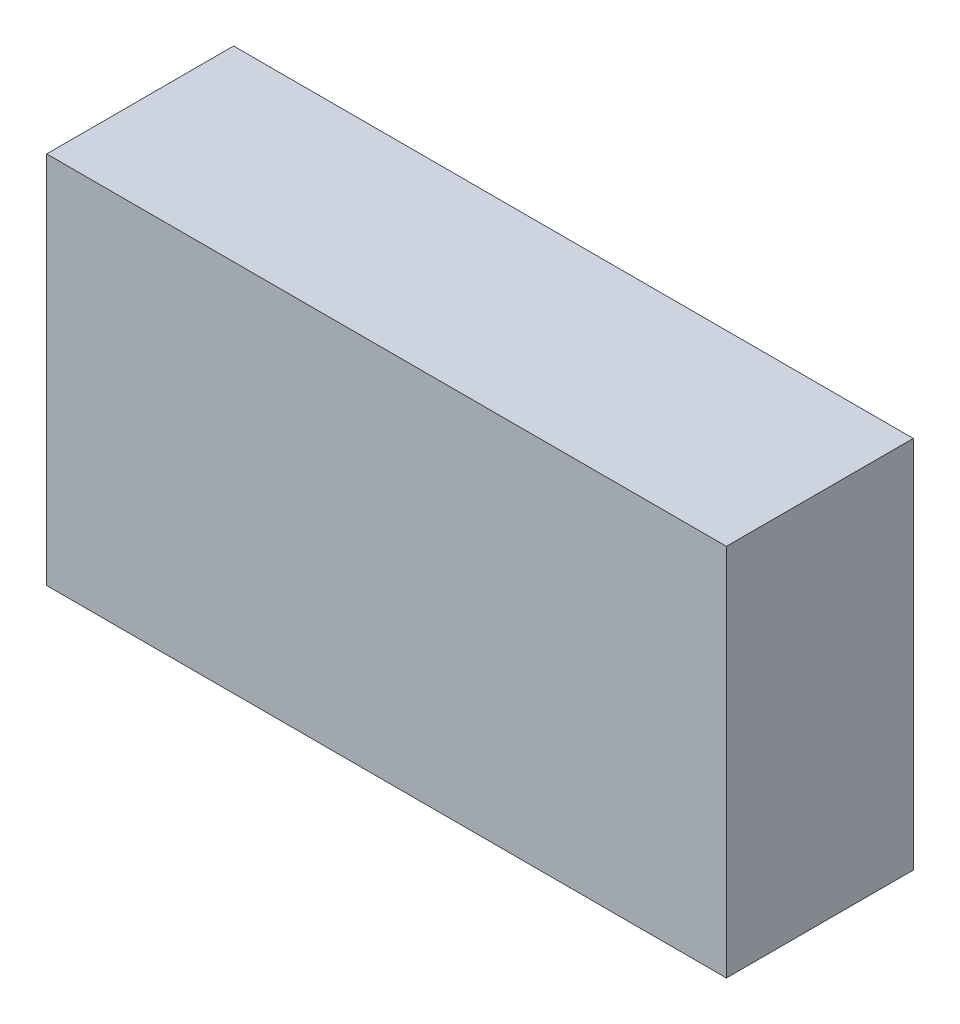
ISO-10303-21;
HEADER;
FILE_DESCRIPTION(('STEP AP214'),'2;1');
FILE_NAME('part.step','',(''),(''),'','','');
FILE_SCHEMA(('AUTOMOTIVE_DESIGN { 1 0 10303 214 1 1 1 1 }'));
ENDSEC;
DATA;
#1=APPLICATION_CONTEXT('core data for automotive mechanical design processes');
#2=APPLICATION_PROTOCOL_DEFINITION('international standard','automotive_design',2000,#1);
#3=PRODUCT_CONTEXT('',#1,'mechanical');
#4=PRODUCT('Part','Part','',(#3));
#5=PRODUCT_RELATED_PRODUCT_CATEGORY('part','',(#4));
#6=PRODUCT_DEFINITION_FORMATION('','',#4);
#7=PRODUCT_DEFINITION_CONTEXT('part definition',#1,'design');
#8=PRODUCT_DEFINITION('design','',#6,#7);
#9=PRODUCT_DEFINITION_SHAPE('','',#8);
#10=(LENGTH_UNIT() NAMED_UNIT(*) SI_UNIT(.MILLI.,.METRE.));
#11=(NAMED_UNIT(*) PLANE_ANGLE_UNIT() SI_UNIT($,.RADIAN.));
#12=(NAMED_UNIT(*) SI_UNIT($,.STERADIAN.) SOLID_ANGLE_UNIT());
#13=UNCERTAINTY_MEASURE_WITH_UNIT(LENGTH_MEASURE(1.E-05),#10,'distance_accuracy_value','');
#14=(GEOMETRIC_REPRESENTATION_CONTEXT(3) GLOBAL_UNCERTAINTY_ASSIGNED_CONTEXT((#13)) GLOBAL_UNIT_ASSIGNED_CONTEXT((#10,
#11,#12)) REPRESENTATION_CONTEXT('',''));
#15=CARTESIAN_POINT('',(0.,0.,0.));
#16=DIRECTION('',(0.,0.,1.));
#17=DIRECTION('',(1.,0.,0.));
#18=AXIS2_PLACEMENT_3D('',#15,#16,#17);
#19=CARTESIAN_POINT('',(3.,27.,11.));
#20=DIRECTION('',(1.,0.,0.));
#21=DIRECTION('',(0.,0.,-1.));
#22=AXIS2_PLACEMENT_3D('',#19,#20,#21);
#23=PLANE('',#22);
#24=DIRECTION('',(0.,-1.,0.));
#25=VECTOR('',#24,1.);
#26=CARTESIAN_POINT('',(3.,27.,0.));
#27=LINE('',#26,#25);
#28=CARTESIAN_POINT('',(3.,27.,0.));
#29=VERTEX_POINT('',#28);
#30=CARTESIAN_POINT('',(3.,5.,0.));
#31=VERTEX_POINT('',#30);
#32=EDGE_CURVE('E104',#29,#31,#27,.T.);
#33=ORIENTED_EDGE('',*,*,#32,.T.);
#34=DIRECTION('',(0.,0.,-1.));
#35=VECTOR('',#34,1.);
#36=CARTESIAN_POINT('',(3.,5.,11.));
#37=LINE('',#36,#35);
#38=CARTESIAN_POINT('',(3.,5.,11.));
#39=VERTEX_POINT('',#38);
#40=EDGE_CURVE('E11',#39,#31,#37,.T.);
#41=ORIENTED_EDGE('',*,*,#40,.F.);
#42=DIRECTION('',(0.,-1.,0.));
#43=VECTOR('',#42,1.);
#44=CARTESIAN_POINT('',(3.,27.,11.));
#45=LINE('',#44,#43);
#46=CARTESIAN_POINT('',(3.,27.,11.));
#47=VERTEX_POINT('',#46);
#48=EDGE_CURVE('E92',#47,#39,#45,.T.);
#49=ORIENTED_EDGE('',*,*,#48,.F.);
#50=DIRECTION('',(0.,0.,-1.));
#51=VECTOR('',#50,1.);
#52=CARTESIAN_POINT('',(3.,27.,11.));
#53=LINE('',#52,#51);
#54=EDGE_CURVE('E100',#47,#29,#53,.T.);
#55=ORIENTED_EDGE('',*,*,#54,.T.);
#56=EDGE_LOOP('',(#33,#41,#49,#55));
#57=FACE_BOUND('',#56,.T.);
#58=ADVANCED_FACE('F41',(#57),#23,.F.);
#59=CARTESIAN_POINT('',(3.,5.,11.));
#60=DIRECTION('',(0.,1.,0.));
#61=DIRECTION('',(0.,0.,1.));
#62=AXIS2_PLACEMENT_3D('',#59,#60,#61);
#63=PLANE('',#62);
#64=DIRECTION('',(1.,0.,0.));
#65=VECTOR('',#64,1.);
#66=CARTESIAN_POINT('',(3.,5.,0.));
#67=LINE('',#66,#65);
#68=CARTESIAN_POINT('',(43.,5.,0.));
#69=VERTEX_POINT('',#68);
#70=EDGE_CURVE('E96',#31,#69,#67,.T.);
#71=ORIENTED_EDGE('',*,*,#70,.T.);
#72=DIRECTION('',(0.,0.,-1.));
#73=VECTOR('',#72,1.);
#74=CARTESIAN_POINT('',(43.,5.,11.));
#75=LINE('',#74,#73);
#76=CARTESIAN_POINT('',(43.,5.,11.));
#77=VERTEX_POINT('',#76);
#78=EDGE_CURVE('E49',#77,#69,#75,.T.);
#79=ORIENTED_EDGE('',*,*,#78,.F.);
#80=DIRECTION('',(1.,0.,0.));
#81=VECTOR('',#80,1.);
#82=CARTESIAN_POINT('',(3.,5.,11.));
#83=LINE('',#82,#81);
#84=EDGE_CURVE('E87',#39,#77,#83,.T.);
#85=ORIENTED_EDGE('',*,*,#84,.F.);
#86=ORIENTED_EDGE('',*,*,#40,.T.);
#87=EDGE_LOOP('',(#71,#79,#85,#86));
#88=FACE_BOUND('',#87,.T.);
#89=ADVANCED_FACE('F95',(#88),#63,.F.);
#90=CARTESIAN_POINT('',(43.,5.,11.));
#91=DIRECTION('',(-1.,0.,0.));
#92=DIRECTION('',(0.,0.,1.));
#93=AXIS2_PLACEMENT_3D('',#90,#91,#92);
#94=PLANE('',#93);
#95=DIRECTION('',(0.,1.,0.));
#96=VECTOR('',#95,1.);
#97=CARTESIAN_POINT('',(43.,5.,0.));
#98=LINE('',#97,#96);
#99=CARTESIAN_POINT('',(43.,27.,0.));
#100=VERTEX_POINT('',#99);
#101=EDGE_CURVE('E74',#69,#100,#98,.T.);
#102=ORIENTED_EDGE('',*,*,#101,.T.);
#103=DIRECTION('',(0.,0.,-1.));
#104=VECTOR('',#103,1.);
#105=CARTESIAN_POINT('',(43.,27.,11.));
#106=LINE('',#105,#104);
#107=CARTESIAN_POINT('',(43.,27.,11.));
#108=VERTEX_POINT('',#107);
#109=EDGE_CURVE('E97',#108,#100,#106,.T.);
#110=ORIENTED_EDGE('',*,*,#109,.F.);
#111=DIRECTION('',(0.,1.,0.));
#112=VECTOR('',#111,1.);
#113=CARTESIAN_POINT('',(43.,5.,11.));
#114=LINE('',#113,#112);
#115=EDGE_CURVE('E90',#77,#108,#114,.T.);
#116=ORIENTED_EDGE('',*,*,#115,.F.);
#117=ORIENTED_EDGE('',*,*,#78,.T.);
#118=EDGE_LOOP('',(#102,#110,#116,#117));
#119=FACE_BOUND('',#118,.T.);
#120=ADVANCED_FACE('F98',(#119),#94,.F.);
#121=CARTESIAN_POINT('',(43.,27.,11.));
#122=DIRECTION('',(0.,-1.,0.));
#123=DIRECTION('',(0.,0.,-1.));
#124=AXIS2_PLACEMENT_3D('',#121,#122,#123);
#125=PLANE('',#124);
#126=DIRECTION('',(-1.,0.,0.));
#127=VECTOR('',#126,1.);
#128=CARTESIAN_POINT('',(43.,27.,0.));
#129=LINE('',#128,#127);
#130=EDGE_CURVE('E80',#100,#29,#129,.T.);
#131=ORIENTED_EDGE('',*,*,#130,.T.);
#132=ORIENTED_EDGE('',*,*,#54,.F.);
#133=DIRECTION('',(-1.,0.,0.));
#134=VECTOR('',#133,1.);
#135=CARTESIAN_POINT('',(43.,27.,11.));
#136=LINE('',#135,#134);
#137=EDGE_CURVE('E57',#108,#47,#136,.T.);
#138=ORIENTED_EDGE('',*,*,#137,.F.);
#139=ORIENTED_EDGE('',*,*,#109,.T.);
#140=EDGE_LOOP('',(#131,#132,#138,#139));
#141=FACE_BOUND('',#140,.T.);
#142=ADVANCED_FACE('F111',(#141),#125,.F.);
#143=CARTESIAN_POINT('',(0.,0.,11.));
#144=DIRECTION('',(0.,0.,1.));
#145=DIRECTION('',(1.,0.,0.));
#146=AXIS2_PLACEMENT_3D('',#143,#144,#145);
#147=PLANE('',#146);
#148=ORIENTED_EDGE('',*,*,#48,.T.);
#149=ORIENTED_EDGE('',*,*,#84,.T.);
#150=ORIENTED_EDGE('',*,*,#115,.T.);
#151=ORIENTED_EDGE('',*,*,#137,.T.);
#152=EDGE_LOOP('',(#148,#149,#150,#151));
#153=FACE_BOUND('',#152,.T.);
#154=ADVANCED_FACE('F88',(#153),#147,.T.);
#155=CARTESIAN_POINT('',(0.,0.,0.));
#156=DIRECTION('',(0.,0.,1.));
#157=DIRECTION('',(1.,0.,0.));
#158=AXIS2_PLACEMENT_3D('',#155,#156,#157);
#159=PLANE('',#158);
#160=ORIENTED_EDGE('',*,*,#32,.F.);
#161=ORIENTED_EDGE('',*,*,#130,.F.);
#162=ORIENTED_EDGE('',*,*,#101,.F.);
#163=ORIENTED_EDGE('',*,*,#70,.F.);
#164=EDGE_LOOP('',(#160,#161,#162,#163));
#165=FACE_BOUND('',#164,.T.);
#166=ADVANCED_FACE('F114',(#165),#159,.F.);
#167=CLOSED_SHELL('',(#58,#89,#120,#142,#154,#166));
#168=MANIFOLD_SOLID_BREP('B2',#167);
#169=ADVANCED_BREP_SHAPE_REPRESENTATION('',(#18,#168),#14);
#170=SHAPE_DEFINITION_REPRESENTATION(#9,#169);
ENDSEC;
END-ISO-10303-21;
